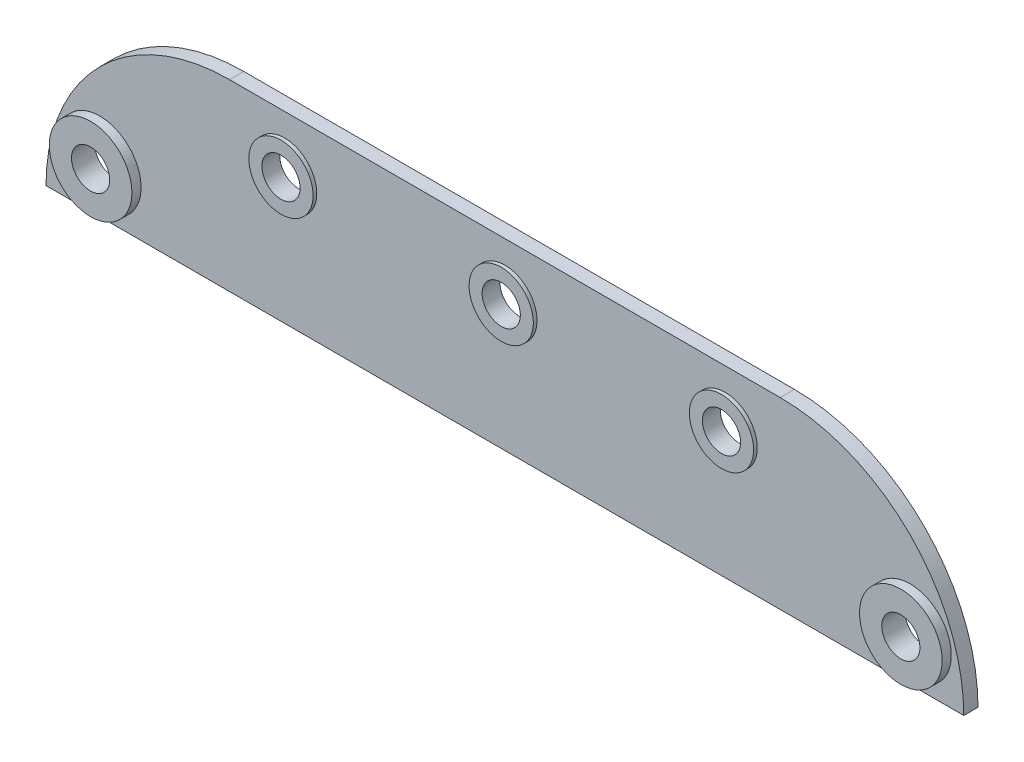
ISO-10303-21;
HEADER;
FILE_DESCRIPTION(('STEP AP214'),'2;1');
FILE_NAME('part.step','',(''),(''),'','','');
FILE_SCHEMA(('AUTOMOTIVE_DESIGN { 1 0 10303 214 1 1 1 1 }'));
ENDSEC;
DATA;
#1=APPLICATION_CONTEXT('core data for automotive mechanical design processes');
#2=APPLICATION_PROTOCOL_DEFINITION('international standard','automotive_design',2000,#1);
#3=PRODUCT_CONTEXT('',#1,'mechanical');
#4=PRODUCT('Part','Part','',(#3));
#5=PRODUCT_RELATED_PRODUCT_CATEGORY('part','',(#4));
#6=PRODUCT_DEFINITION_FORMATION('','',#4);
#7=PRODUCT_DEFINITION_CONTEXT('part definition',#1,'design');
#8=PRODUCT_DEFINITION('design','',#6,#7);
#9=PRODUCT_DEFINITION_SHAPE('','',#8);
#10=(LENGTH_UNIT() NAMED_UNIT(*) SI_UNIT(.MILLI.,.METRE.));
#11=(NAMED_UNIT(*) PLANE_ANGLE_UNIT() SI_UNIT($,.RADIAN.));
#12=(NAMED_UNIT(*) SI_UNIT($,.STERADIAN.) SOLID_ANGLE_UNIT());
#13=UNCERTAINTY_MEASURE_WITH_UNIT(LENGTH_MEASURE(1.E-05),#10,'distance_accuracy_value','');
#14=(GEOMETRIC_REPRESENTATION_CONTEXT(3) GLOBAL_UNCERTAINTY_ASSIGNED_CONTEXT((#13)) GLOBAL_UNIT_ASSIGNED_CONTEXT((#10,
#11,#12)) REPRESENTATION_CONTEXT('',''));
#15=CARTESIAN_POINT('',(0.,0.,0.));
#16=DIRECTION('',(0.,0.,1.));
#17=DIRECTION('',(1.,0.,0.));
#18=AXIS2_PLACEMENT_3D('',#15,#16,#17);
#19=CARTESIAN_POINT('',(60.0000000000001,-20.,3.1));
#20=DIRECTION('',(0.,0.,-1.));
#21=DIRECTION('',(-1.,0.,0.));
#22=AXIS2_PLACEMENT_3D('',#19,#20,#21);
#23=PLANE('',#22);
#24=CARTESIAN_POINT('',(-88.284271247462,-10.,3.1));
#25=DIRECTION('',(0.,0.,-1.));
#26=DIRECTION('',(-1.,0.,0.));
#27=AXIS2_PLACEMENT_3D('',#24,#25,#26);
#28=CIRCLE('',#27,9.);
#29=CARTESIAN_POINT('',(-97.284271247462,-10.,3.1));
#30=VERTEX_POINT('',#29);
#31=EDGE_CURVE('E42',#30,#30,#28,.F.);
#32=ORIENTED_EDGE('',*,*,#31,.F.);
#33=EDGE_LOOP('',(#32));
#34=FACE_BOUND('',#33,.T.);
#35=CARTESIAN_POINT('',(0.,8.,3.1));
#36=DIRECTION('',(0.,0.,-1.));
#37=DIRECTION('',(-1.,0.,0.));
#38=AXIS2_PLACEMENT_3D('',#35,#36,#37);
#39=CIRCLE('',#38,7.);
#40=CARTESIAN_POINT('',(-7.,8.,3.1));
#41=VERTEX_POINT('',#40);
#42=EDGE_CURVE('E114',#41,#41,#39,.F.);
#43=ORIENTED_EDGE('',*,*,#42,.F.);
#44=EDGE_LOOP('',(#43));
#45=FACE_BOUND('',#44,.T.);
#46=CARTESIAN_POINT('',(60.0000000000001,-20.,3.1));
#47=DIRECTION('',(0.,0.,1.));
#48=DIRECTION('',(-1.,0.,0.));
#49=AXIS2_PLACEMENT_3D('',#46,#47,#48);
#50=CIRCLE('',#49,40.);
#51=CARTESIAN_POINT('',(100.,-20.,3.1));
#52=VERTEX_POINT('',#51);
#53=CARTESIAN_POINT('',(60.0000000000001,20.,3.1));
#54=VERTEX_POINT('',#53);
#55=EDGE_CURVE('E86',#52,#54,#50,.T.);
#56=ORIENTED_EDGE('',*,*,#55,.T.);
#57=DIRECTION('',(-1.,0.,0.));
#58=VECTOR('',#57,1.);
#59=CARTESIAN_POINT('',(-60.0000000000001,20.,3.1));
#60=LINE('',#59,#58);
#61=CARTESIAN_POINT('',(-60.0000000000001,20.,3.1));
#62=VERTEX_POINT('',#61);
#63=EDGE_CURVE('E81',#54,#62,#60,.T.);
#64=ORIENTED_EDGE('',*,*,#63,.T.);
#65=CARTESIAN_POINT('',(-60.0000000000001,-20.,3.1));
#66=DIRECTION('',(0.,0.,1.));
#67=DIRECTION('',(1.,0.,0.));
#68=AXIS2_PLACEMENT_3D('',#65,#66,#67);
#69=CIRCLE('',#68,40.);
#70=CARTESIAN_POINT('',(-100.,-20.,3.1));
#71=VERTEX_POINT('',#70);
#72=EDGE_CURVE('E84',#62,#71,#69,.T.);
#73=ORIENTED_EDGE('',*,*,#72,.T.);
#74=DIRECTION('',(1.,0.,0.));
#75=VECTOR('',#74,1.);
#76=CARTESIAN_POINT('',(-100.,-20.,3.1));
#77=LINE('',#76,#75);
#78=EDGE_CURVE('E50',#71,#52,#77,.T.);
#79=ORIENTED_EDGE('',*,*,#78,.T.);
#80=EDGE_LOOP('',(#56,#64,#73,#79));
#81=FACE_BOUND('',#80,.T.);
#82=CARTESIAN_POINT('',(-48.,8.,3.1));
#83=DIRECTION('',(0.,0.,-1.));
#84=DIRECTION('',(-1.,0.,0.));
#85=AXIS2_PLACEMENT_3D('',#82,#83,#84);
#86=CIRCLE('',#85,7.);
#87=CARTESIAN_POINT('',(-55.,8.,3.1));
#88=VERTEX_POINT('',#87);
#89=EDGE_CURVE('E111',#88,#88,#86,.F.);
#90=ORIENTED_EDGE('',*,*,#89,.F.);
#91=EDGE_LOOP('',(#90));
#92=FACE_BOUND('',#91,.T.);
#93=CARTESIAN_POINT('',(48.,8.,3.1));
#94=DIRECTION('',(0.,0.,-1.));
#95=DIRECTION('',(-1.,0.,0.));
#96=AXIS2_PLACEMENT_3D('',#93,#94,#95);
#97=CIRCLE('',#96,7.);
#98=CARTESIAN_POINT('',(41.,8.,3.1));
#99=VERTEX_POINT('',#98);
#100=EDGE_CURVE('E117',#99,#99,#97,.F.);
#101=ORIENTED_EDGE('',*,*,#100,.F.);
#102=EDGE_LOOP('',(#101));
#103=FACE_BOUND('',#102,.T.);
#104=CARTESIAN_POINT('',(88.284271247462,-10.,3.1));
#105=DIRECTION('',(0.,0.,-1.));
#106=DIRECTION('',(-1.,0.,0.));
#107=AXIS2_PLACEMENT_3D('',#104,#105,#106);
#108=CIRCLE('',#107,9.);
#109=CARTESIAN_POINT('',(79.284271247462,-10.,3.1));
#110=VERTEX_POINT('',#109);
#111=EDGE_CURVE('E11',#110,#110,#108,.F.);
#112=ORIENTED_EDGE('',*,*,#111,.F.);
#113=EDGE_LOOP('',(#112));
#114=FACE_BOUND('',#113,.T.);
#115=ADVANCED_FACE('F33',(#34,#45,#81,#92,#103,#114),#23,.F.);
#116=CARTESIAN_POINT('',(60.0000000000001,-20.,0.));
#117=DIRECTION('',(0.,0.,-1.));
#118=DIRECTION('',(-1.,0.,0.));
#119=AXIS2_PLACEMENT_3D('',#116,#117,#118);
#120=PLANE('',#119);
#121=CARTESIAN_POINT('',(-88.284271247462,-10.,0.));
#122=DIRECTION('',(0.,0.,1.));
#123=DIRECTION('',(1.,0.,0.));
#124=AXIS2_PLACEMENT_3D('',#121,#122,#123);
#125=CIRCLE('',#124,4.165);
#126=CARTESIAN_POINT('',(-92.449271247462,-10.,0.));
#127=VERTEX_POINT('',#126);
#128=EDGE_CURVE('E203',#127,#127,#125,.T.);
#129=ORIENTED_EDGE('',*,*,#128,.T.);
#130=EDGE_LOOP('',(#129));
#131=FACE_BOUND('',#130,.T.);
#132=CARTESIAN_POINT('',(48.,8.,0.));
#133=DIRECTION('',(0.,0.,1.));
#134=DIRECTION('',(1.,0.,0.));
#135=AXIS2_PLACEMENT_3D('',#132,#133,#134);
#136=CIRCLE('',#135,4.165);
#137=CARTESIAN_POINT('',(43.835,8.,0.));
#138=VERTEX_POINT('',#137);
#139=EDGE_CURVE('E214',#138,#138,#136,.T.);
#140=ORIENTED_EDGE('',*,*,#139,.T.);
#141=EDGE_LOOP('',(#140));
#142=FACE_BOUND('',#141,.T.);
#143=CARTESIAN_POINT('',(60.0000000000001,-20.,0.));
#144=DIRECTION('',(0.,0.,1.));
#145=DIRECTION('',(-1.,0.,0.));
#146=AXIS2_PLACEMENT_3D('',#143,#144,#145);
#147=CIRCLE('',#146,40.);
#148=CARTESIAN_POINT('',(100.,-20.,0.));
#149=VERTEX_POINT('',#148);
#150=CARTESIAN_POINT('',(60.0000000000001,20.,0.));
#151=VERTEX_POINT('',#150);
#152=EDGE_CURVE('E101',#149,#151,#147,.T.);
#153=ORIENTED_EDGE('',*,*,#152,.F.);
#154=DIRECTION('',(1.,0.,0.));
#155=VECTOR('',#154,1.);
#156=CARTESIAN_POINT('',(-100.,-20.,0.));
#157=LINE('',#156,#155);
#158=CARTESIAN_POINT('',(-100.,-20.,0.));
#159=VERTEX_POINT('',#158);
#160=EDGE_CURVE('E73',#159,#149,#157,.T.);
#161=ORIENTED_EDGE('',*,*,#160,.F.);
#162=CARTESIAN_POINT('',(-60.0000000000001,-20.,0.));
#163=DIRECTION('',(0.,0.,1.));
#164=DIRECTION('',(1.,0.,0.));
#165=AXIS2_PLACEMENT_3D('',#162,#163,#164);
#166=CIRCLE('',#165,40.);
#167=CARTESIAN_POINT('',(-60.0000000000001,20.,0.));
#168=VERTEX_POINT('',#167);
#169=EDGE_CURVE('E67',#168,#159,#166,.T.);
#170=ORIENTED_EDGE('',*,*,#169,.F.);
#171=DIRECTION('',(-1.,0.,0.));
#172=VECTOR('',#171,1.);
#173=CARTESIAN_POINT('',(-60.0000000000001,20.,0.));
#174=LINE('',#173,#172);
#175=EDGE_CURVE('E91',#151,#168,#174,.T.);
#176=ORIENTED_EDGE('',*,*,#175,.F.);
#177=EDGE_LOOP('',(#153,#161,#170,#176));
#178=FACE_BOUND('',#177,.T.);
#179=CARTESIAN_POINT('',(0.,8.,0.));
#180=DIRECTION('',(0.,0.,1.));
#181=DIRECTION('',(1.,0.,0.));
#182=AXIS2_PLACEMENT_3D('',#179,#180,#181);
#183=CIRCLE('',#182,4.165);
#184=CARTESIAN_POINT('',(-4.165,8.,0.));
#185=VERTEX_POINT('',#184);
#186=EDGE_CURVE('E104',#185,#185,#183,.T.);
#187=ORIENTED_EDGE('',*,*,#186,.T.);
#188=EDGE_LOOP('',(#187));
#189=FACE_BOUND('',#188,.T.);
#190=CARTESIAN_POINT('',(-48.,8.,0.));
#191=DIRECTION('',(0.,0.,1.));
#192=DIRECTION('',(1.,0.,0.));
#193=AXIS2_PLACEMENT_3D('',#190,#191,#192);
#194=CIRCLE('',#193,4.165);
#195=CARTESIAN_POINT('',(-52.165,8.,0.));
#196=VERTEX_POINT('',#195);
#197=EDGE_CURVE('E199',#196,#196,#194,.T.);
#198=ORIENTED_EDGE('',*,*,#197,.T.);
#199=EDGE_LOOP('',(#198));
#200=FACE_BOUND('',#199,.T.);
#201=CARTESIAN_POINT('',(88.284271247462,-10.,0.));
#202=DIRECTION('',(0.,0.,1.));
#203=DIRECTION('',(1.,0.,0.));
#204=AXIS2_PLACEMENT_3D('',#201,#202,#203);
#205=CIRCLE('',#204,4.165);
#206=CARTESIAN_POINT('',(84.119271247462,-10.,0.));
#207=VERTEX_POINT('',#206);
#208=EDGE_CURVE('E202',#207,#207,#205,.T.);
#209=ORIENTED_EDGE('',*,*,#208,.T.);
#210=EDGE_LOOP('',(#209));
#211=FACE_BOUND('',#210,.T.);
#212=ADVANCED_FACE('F126',(#131,#142,#178,#189,#200,#211),#120,.T.);
#213=CARTESIAN_POINT('',(60.0000000000001,-20.,3.1));
#214=DIRECTION('',(0.,0.,-1.));
#215=DIRECTION('',(-1.,0.,0.));
#216=AXIS2_PLACEMENT_3D('',#213,#214,#215);
#217=CYLINDRICAL_SURFACE('',#216,40.);
#218=ORIENTED_EDGE('',*,*,#152,.T.);
#219=DIRECTION('',(0.,0.,-1.));
#220=VECTOR('',#219,1.);
#221=CARTESIAN_POINT('',(60.0000000000001,20.,3.1));
#222=LINE('',#221,#220);
#223=EDGE_CURVE('E92',#54,#151,#222,.T.);
#224=ORIENTED_EDGE('',*,*,#223,.F.);
#225=ORIENTED_EDGE('',*,*,#55,.F.);
#226=DIRECTION('',(0.,0.,-1.));
#227=VECTOR('',#226,1.);
#228=CARTESIAN_POINT('',(100.,-20.,3.1));
#229=LINE('',#228,#227);
#230=EDGE_CURVE('E97',#52,#149,#229,.T.);
#231=ORIENTED_EDGE('',*,*,#230,.T.);
#232=EDGE_LOOP('',(#218,#224,#225,#231));
#233=FACE_BOUND('',#232,.T.);
#234=ADVANCED_FACE('F35',(#233),#217,.T.);
#235=CARTESIAN_POINT('',(-60.0000000000001,20.,3.1));
#236=DIRECTION('',(0.,-1.,0.));
#237=DIRECTION('',(0.,0.,-1.));
#238=AXIS2_PLACEMENT_3D('',#235,#236,#237);
#239=PLANE('',#238);
#240=ORIENTED_EDGE('',*,*,#175,.T.);
#241=DIRECTION('',(0.,0.,-1.));
#242=VECTOR('',#241,1.);
#243=CARTESIAN_POINT('',(-60.0000000000001,20.,3.1));
#244=LINE('',#243,#242);
#245=EDGE_CURVE('E89',#62,#168,#244,.T.);
#246=ORIENTED_EDGE('',*,*,#245,.F.);
#247=ORIENTED_EDGE('',*,*,#63,.F.);
#248=ORIENTED_EDGE('',*,*,#223,.T.);
#249=EDGE_LOOP('',(#240,#246,#247,#248));
#250=FACE_BOUND('',#249,.T.);
#251=ADVANCED_FACE('F90',(#250),#239,.F.);
#252=CARTESIAN_POINT('',(-60.0000000000001,-20.,3.1));
#253=DIRECTION('',(0.,0.,-1.));
#254=DIRECTION('',(-1.,0.,0.));
#255=AXIS2_PLACEMENT_3D('',#252,#253,#254);
#256=CYLINDRICAL_SURFACE('',#255,40.);
#257=ORIENTED_EDGE('',*,*,#169,.T.);
#258=DIRECTION('',(0.,0.,-1.));
#259=VECTOR('',#258,1.);
#260=CARTESIAN_POINT('',(-100.,-20.,3.1));
#261=LINE('',#260,#259);
#262=EDGE_CURVE('E93',#71,#159,#261,.T.);
#263=ORIENTED_EDGE('',*,*,#262,.F.);
#264=ORIENTED_EDGE('',*,*,#72,.F.);
#265=ORIENTED_EDGE('',*,*,#245,.T.);
#266=EDGE_LOOP('',(#257,#263,#264,#265));
#267=FACE_BOUND('',#266,.T.);
#268=ADVANCED_FACE('F95',(#267),#256,.T.);
#269=CARTESIAN_POINT('',(-100.,-20.,3.1));
#270=DIRECTION('',(0.,1.,0.));
#271=DIRECTION('',(0.,0.,1.));
#272=AXIS2_PLACEMENT_3D('',#269,#270,#271);
#273=PLANE('',#272);
#274=ORIENTED_EDGE('',*,*,#160,.T.);
#275=ORIENTED_EDGE('',*,*,#230,.F.);
#276=ORIENTED_EDGE('',*,*,#78,.F.);
#277=ORIENTED_EDGE('',*,*,#262,.T.);
#278=EDGE_LOOP('',(#274,#275,#276,#277));
#279=FACE_BOUND('',#278,.T.);
#280=ADVANCED_FACE('F174',(#279),#273,.F.);
#281=CARTESIAN_POINT('',(0.,8.,3.1));
#282=DIRECTION('',(0.,0.,-1.));
#283=DIRECTION('',(-1.,0.,0.));
#284=AXIS2_PLACEMENT_3D('',#281,#282,#283);
#285=CYLINDRICAL_SURFACE('',#284,4.165);
#286=CARTESIAN_POINT('',(0.,8.,3.9));
#287=DIRECTION('',(0.,0.,1.));
#288=DIRECTION('',(1.,0.,0.));
#289=AXIS2_PLACEMENT_3D('',#286,#287,#288);
#290=CIRCLE('',#289,4.165);
#291=CARTESIAN_POINT('',(-4.165,8.,3.9));
#292=VERTEX_POINT('',#291);
#293=EDGE_CURVE('E228',#292,#292,#290,.T.);
#294=CARTESIAN_POINT('',(-4.165,8.,0.));
#295=CARTESIAN_POINT('',(-4.165,8.,0.040625));
#296=CARTESIAN_POINT('',(-4.165,8.,0.08125));
#297=CARTESIAN_POINT('',(-4.165,8.,0.1625));
#298=CARTESIAN_POINT('',(-4.165,8.,0.203125));
#299=CARTESIAN_POINT('',(-4.165,8.,0.284375));
#300=CARTESIAN_POINT('',(-4.165,8.,0.325));
#301=CARTESIAN_POINT('',(-4.165,8.,0.40625));
#302=CARTESIAN_POINT('',(-4.165,8.,0.446875));
#303=CARTESIAN_POINT('',(-4.165,8.,0.528125));
#304=CARTESIAN_POINT('',(-4.165,8.,0.56875));
#305=CARTESIAN_POINT('',(-4.165,8.,0.65));
#306=CARTESIAN_POINT('',(-4.165,8.,0.690625));
#307=CARTESIAN_POINT('',(-4.165,8.,0.771875));
#308=CARTESIAN_POINT('',(-4.165,8.,0.8125));
#309=CARTESIAN_POINT('',(-4.165,8.,0.89375));
#310=CARTESIAN_POINT('',(-4.165,8.,0.934375));
#311=CARTESIAN_POINT('',(-4.165,8.,1.015625));
#312=CARTESIAN_POINT('',(-4.165,8.,1.05625));
#313=CARTESIAN_POINT('',(-4.165,8.,1.1375));
#314=CARTESIAN_POINT('',(-4.165,8.,1.178125));
#315=CARTESIAN_POINT('',(-4.165,8.,1.259375));
#316=CARTESIAN_POINT('',(-4.165,8.,1.3));
#317=CARTESIAN_POINT('',(-4.165,8.,1.38125));
#318=CARTESIAN_POINT('',(-4.165,8.,1.421875));
#319=CARTESIAN_POINT('',(-4.165,8.,1.503125));
#320=CARTESIAN_POINT('',(-4.165,8.,1.54375));
#321=CARTESIAN_POINT('',(-4.165,8.,1.625));
#322=CARTESIAN_POINT('',(-4.165,8.,1.665625));
#323=CARTESIAN_POINT('',(-4.165,8.,1.746875));
#324=CARTESIAN_POINT('',(-4.165,8.,1.7875));
#325=CARTESIAN_POINT('',(-4.165,8.,1.86875));
#326=CARTESIAN_POINT('',(-4.165,8.,1.909375));
#327=CARTESIAN_POINT('',(-4.165,8.,1.990625));
#328=CARTESIAN_POINT('',(-4.165,8.,2.03125));
#329=CARTESIAN_POINT('',(-4.165,8.,2.1125));
#330=CARTESIAN_POINT('',(-4.165,8.,2.153125));
#331=CARTESIAN_POINT('',(-4.165,8.,2.234375));
#332=CARTESIAN_POINT('',(-4.165,8.,2.275));
#333=CARTESIAN_POINT('',(-4.165,8.,2.35625));
#334=CARTESIAN_POINT('',(-4.165,8.,2.396875));
#335=CARTESIAN_POINT('',(-4.165,8.,2.478125));
#336=CARTESIAN_POINT('',(-4.165,8.,2.51875));
#337=CARTESIAN_POINT('',(-4.165,8.,2.6));
#338=CARTESIAN_POINT('',(-4.165,8.,2.640625));
#339=CARTESIAN_POINT('',(-4.165,8.,2.721875));
#340=CARTESIAN_POINT('',(-4.165,8.,2.7625));
#341=CARTESIAN_POINT('',(-4.165,8.,2.84375));
#342=CARTESIAN_POINT('',(-4.165,8.,2.884375));
#343=CARTESIAN_POINT('',(-4.165,8.,2.965625));
#344=CARTESIAN_POINT('',(-4.165,8.,3.00625));
#345=CARTESIAN_POINT('',(-4.165,8.,3.0875));
#346=CARTESIAN_POINT('',(-4.165,8.,3.128125));
#347=CARTESIAN_POINT('',(-4.165,8.,3.209375));
#348=CARTESIAN_POINT('',(-4.165,8.,3.25));
#349=CARTESIAN_POINT('',(-4.165,8.,3.33125));
#350=CARTESIAN_POINT('',(-4.165,8.,3.371875));
#351=CARTESIAN_POINT('',(-4.165,8.,3.453125));
#352=CARTESIAN_POINT('',(-4.165,8.,3.49375));
#353=CARTESIAN_POINT('',(-4.165,8.,3.575));
#354=CARTESIAN_POINT('',(-4.165,8.,3.615625));
#355=CARTESIAN_POINT('',(-4.165,8.,3.696875));
#356=CARTESIAN_POINT('',(-4.165,8.,3.7375));
#357=CARTESIAN_POINT('',(-4.165,8.,3.81875));
#358=CARTESIAN_POINT('',(-4.165,8.,3.859375));
#359=CARTESIAN_POINT('',(-4.165,8.,3.9));
#360=B_SPLINE_CURVE_WITH_KNOTS('',3,(#294,#295,#296,#297,#298,#299,#300,#301,#302,#303,#304,
#305,#306,#307,#308,#309,#310,#311,#312,#313,#314,#315,#316,#317,#318,#319,#320,#321,#322,#323,
#324,#325,#326,#327,#328,#329,#330,#331,#332,#333,#334,#335,#336,#337,#338,#339,#340,#341,#342,
#343,#344,#345,#346,#347,#348,#349,#350,#351,#352,#353,#354,#355,#356,#357,#358,#359),
.UNSPECIFIED.,.F.,.F.,(4,2,2,2,2,2,2,2,2,2,2,2,2,2,2,2,2,2,2,2,2,2,2,2,2,2,2,2,2,2,2,2,4),(0.,
0.121875,0.24375,0.365625,0.4875,0.609375,0.73125,0.853125,0.975,1.096875,1.21875,1.340625,
1.4625,1.584375,1.70625,1.828125,1.95,2.071875,2.19375,2.315625,2.4375,2.559375,2.68125,
2.803125,2.925,3.046875,3.16875,3.290625,3.4125,3.534375,3.65625,3.778125,3.9),.UNSPECIFIED.);
#361=EDGE_CURVE('BSEAM171',#185,#292,#360,.T.);
#362=ORIENTED_EDGE('',*,*,#186,.F.);
#363=ORIENTED_EDGE('',*,*,#293,.T.);
#364=ORIENTED_EDGE('',*,*,#361,.T.);
#365=ORIENTED_EDGE('',*,*,#361,.F.);
#366=EDGE_LOOP('',(#362,#364,#363,#365));
#367=FACE_BOUND('',#366,.T.);
#368=ADVANCED_FACE('F171',(#367),#285,.F.);
#369=CARTESIAN_POINT('',(48.,8.,3.1));
#370=DIRECTION('',(0.,0.,-1.));
#371=DIRECTION('',(-1.,0.,0.));
#372=AXIS2_PLACEMENT_3D('',#369,#370,#371);
#373=CYLINDRICAL_SURFACE('',#372,4.165);
#374=CARTESIAN_POINT('',(48.,8.,3.9));
#375=DIRECTION('',(0.,0.,1.));
#376=DIRECTION('',(1.,0.,0.));
#377=AXIS2_PLACEMENT_3D('',#374,#375,#376);
#378=CIRCLE('',#377,4.165);
#379=CARTESIAN_POINT('',(43.835,8.,3.9));
#380=VERTEX_POINT('',#379);
#381=EDGE_CURVE('E222',#380,#380,#378,.T.);
#382=CARTESIAN_POINT('',(43.835,8.,0.));
#383=CARTESIAN_POINT('',(43.835,8.,0.040625));
#384=CARTESIAN_POINT('',(43.835,8.,0.08125));
#385=CARTESIAN_POINT('',(43.835,8.,0.1625));
#386=CARTESIAN_POINT('',(43.835,8.,0.203125));
#387=CARTESIAN_POINT('',(43.835,8.,0.284375));
#388=CARTESIAN_POINT('',(43.835,8.,0.325));
#389=CARTESIAN_POINT('',(43.835,8.,0.40625));
#390=CARTESIAN_POINT('',(43.835,8.,0.446875));
#391=CARTESIAN_POINT('',(43.835,8.,0.528125));
#392=CARTESIAN_POINT('',(43.835,8.,0.56875));
#393=CARTESIAN_POINT('',(43.835,8.,0.65));
#394=CARTESIAN_POINT('',(43.835,8.,0.690625));
#395=CARTESIAN_POINT('',(43.835,8.,0.771875));
#396=CARTESIAN_POINT('',(43.835,8.,0.8125));
#397=CARTESIAN_POINT('',(43.835,8.,0.89375));
#398=CARTESIAN_POINT('',(43.835,8.,0.934375));
#399=CARTESIAN_POINT('',(43.835,8.,1.015625));
#400=CARTESIAN_POINT('',(43.835,8.,1.05625));
#401=CARTESIAN_POINT('',(43.835,8.,1.1375));
#402=CARTESIAN_POINT('',(43.835,8.,1.178125));
#403=CARTESIAN_POINT('',(43.835,8.,1.259375));
#404=CARTESIAN_POINT('',(43.835,8.,1.3));
#405=CARTESIAN_POINT('',(43.835,8.,1.38125));
#406=CARTESIAN_POINT('',(43.835,8.,1.421875));
#407=CARTESIAN_POINT('',(43.835,8.,1.503125));
#408=CARTESIAN_POINT('',(43.835,8.,1.54375));
#409=CARTESIAN_POINT('',(43.835,8.,1.625));
#410=CARTESIAN_POINT('',(43.835,8.,1.665625));
#411=CARTESIAN_POINT('',(43.835,8.,1.746875));
#412=CARTESIAN_POINT('',(43.835,8.,1.7875));
#413=CARTESIAN_POINT('',(43.835,8.,1.86875));
#414=CARTESIAN_POINT('',(43.835,8.,1.909375));
#415=CARTESIAN_POINT('',(43.835,8.,1.990625));
#416=CARTESIAN_POINT('',(43.835,8.,2.03125));
#417=CARTESIAN_POINT('',(43.835,8.,2.1125));
#418=CARTESIAN_POINT('',(43.835,8.,2.153125));
#419=CARTESIAN_POINT('',(43.835,8.,2.234375));
#420=CARTESIAN_POINT('',(43.835,8.,2.275));
#421=CARTESIAN_POINT('',(43.835,8.,2.35625));
#422=CARTESIAN_POINT('',(43.835,8.,2.396875));
#423=CARTESIAN_POINT('',(43.835,8.,2.478125));
#424=CARTESIAN_POINT('',(43.835,8.,2.51875));
#425=CARTESIAN_POINT('',(43.835,8.,2.6));
#426=CARTESIAN_POINT('',(43.835,8.,2.640625));
#427=CARTESIAN_POINT('',(43.835,8.,2.721875));
#428=CARTESIAN_POINT('',(43.835,8.,2.7625));
#429=CARTESIAN_POINT('',(43.835,8.,2.84375));
#430=CARTESIAN_POINT('',(43.835,8.,2.884375));
#431=CARTESIAN_POINT('',(43.835,8.,2.965625));
#432=CARTESIAN_POINT('',(43.835,8.,3.00625));
#433=CARTESIAN_POINT('',(43.835,8.,3.0875));
#434=CARTESIAN_POINT('',(43.835,8.,3.128125));
#435=CARTESIAN_POINT('',(43.835,8.,3.209375));
#436=CARTESIAN_POINT('',(43.835,8.,3.25));
#437=CARTESIAN_POINT('',(43.835,8.,3.33125));
#438=CARTESIAN_POINT('',(43.835,8.,3.371875));
#439=CARTESIAN_POINT('',(43.835,8.,3.453125));
#440=CARTESIAN_POINT('',(43.835,8.,3.49375));
#441=CARTESIAN_POINT('',(43.835,8.,3.575));
#442=CARTESIAN_POINT('',(43.835,8.,3.615625));
#443=CARTESIAN_POINT('',(43.835,8.,3.696875));
#444=CARTESIAN_POINT('',(43.835,8.,3.7375));
#445=CARTESIAN_POINT('',(43.835,8.,3.81875));
#446=CARTESIAN_POINT('',(43.835,8.,3.859375));
#447=CARTESIAN_POINT('',(43.835,8.,3.9));
#448=B_SPLINE_CURVE_WITH_KNOTS('',3,(#382,#383,#384,#385,#386,#387,#388,#389,#390,#391,#392,
#393,#394,#395,#396,#397,#398,#399,#400,#401,#402,#403,#404,#405,#406,#407,#408,#409,#410,#411,
#412,#413,#414,#415,#416,#417,#418,#419,#420,#421,#422,#423,#424,#425,#426,#427,#428,#429,#430,
#431,#432,#433,#434,#435,#436,#437,#438,#439,#440,#441,#442,#443,#444,#445,#446,#447),
.UNSPECIFIED.,.F.,.F.,(4,2,2,2,2,2,2,2,2,2,2,2,2,2,2,2,2,2,2,2,2,2,2,2,2,2,2,2,2,2,2,2,4),(0.,
0.121875,0.24375,0.365625,0.4875,0.609375,0.73125,0.853125,0.975,1.096875,1.21875,1.340625,
1.4625,1.584375,1.70625,1.828125,1.95,2.071875,2.19375,2.315625,2.4375,2.559375,2.68125,
2.803125,2.925,3.046875,3.16875,3.290625,3.4125,3.534375,3.65625,3.778125,3.9),.UNSPECIFIED.);
#449=EDGE_CURVE('BSEAM167',#138,#380,#448,.T.);
#450=ORIENTED_EDGE('',*,*,#139,.F.);
#451=ORIENTED_EDGE('',*,*,#381,.T.);
#452=ORIENTED_EDGE('',*,*,#449,.T.);
#453=ORIENTED_EDGE('',*,*,#449,.F.);
#454=EDGE_LOOP('',(#450,#452,#451,#453));
#455=FACE_BOUND('',#454,.T.);
#456=ADVANCED_FACE('F167',(#455),#373,.F.);
#457=CARTESIAN_POINT('',(-48.,8.,3.1));
#458=DIRECTION('',(0.,0.,-1.));
#459=DIRECTION('',(-1.,0.,0.));
#460=AXIS2_PLACEMENT_3D('',#457,#458,#459);
#461=CYLINDRICAL_SURFACE('',#460,4.165);
#462=CARTESIAN_POINT('',(-48.,8.,3.9));
#463=DIRECTION('',(0.,0.,1.));
#464=DIRECTION('',(1.,0.,0.));
#465=AXIS2_PLACEMENT_3D('',#462,#463,#464);
#466=CIRCLE('',#465,4.165);
#467=CARTESIAN_POINT('',(-52.165,8.,3.9));
#468=VERTEX_POINT('',#467);
#469=EDGE_CURVE('E209',#468,#468,#466,.T.);
#470=CARTESIAN_POINT('',(-52.165,8.,0.));
#471=CARTESIAN_POINT('',(-52.165,8.,0.040625));
#472=CARTESIAN_POINT('',(-52.165,8.,0.08125));
#473=CARTESIAN_POINT('',(-52.165,8.,0.1625));
#474=CARTESIAN_POINT('',(-52.165,8.,0.203125));
#475=CARTESIAN_POINT('',(-52.165,8.,0.284375));
#476=CARTESIAN_POINT('',(-52.165,8.,0.325));
#477=CARTESIAN_POINT('',(-52.165,8.,0.40625));
#478=CARTESIAN_POINT('',(-52.165,8.,0.446875));
#479=CARTESIAN_POINT('',(-52.165,8.,0.528125));
#480=CARTESIAN_POINT('',(-52.165,8.,0.56875));
#481=CARTESIAN_POINT('',(-52.165,8.,0.65));
#482=CARTESIAN_POINT('',(-52.165,8.,0.690625));
#483=CARTESIAN_POINT('',(-52.165,8.,0.771875));
#484=CARTESIAN_POINT('',(-52.165,8.,0.8125));
#485=CARTESIAN_POINT('',(-52.165,8.,0.89375));
#486=CARTESIAN_POINT('',(-52.165,8.,0.934375));
#487=CARTESIAN_POINT('',(-52.165,8.,1.015625));
#488=CARTESIAN_POINT('',(-52.165,8.,1.05625));
#489=CARTESIAN_POINT('',(-52.165,8.,1.1375));
#490=CARTESIAN_POINT('',(-52.165,8.,1.178125));
#491=CARTESIAN_POINT('',(-52.165,8.,1.259375));
#492=CARTESIAN_POINT('',(-52.165,8.,1.3));
#493=CARTESIAN_POINT('',(-52.165,8.,1.38125));
#494=CARTESIAN_POINT('',(-52.165,8.,1.421875));
#495=CARTESIAN_POINT('',(-52.165,8.,1.503125));
#496=CARTESIAN_POINT('',(-52.165,8.,1.54375));
#497=CARTESIAN_POINT('',(-52.165,8.,1.625));
#498=CARTESIAN_POINT('',(-52.165,8.,1.665625));
#499=CARTESIAN_POINT('',(-52.165,8.,1.746875));
#500=CARTESIAN_POINT('',(-52.165,8.,1.7875));
#501=CARTESIAN_POINT('',(-52.165,8.,1.86875));
#502=CARTESIAN_POINT('',(-52.165,8.,1.909375));
#503=CARTESIAN_POINT('',(-52.165,8.,1.990625));
#504=CARTESIAN_POINT('',(-52.165,8.,2.03125));
#505=CARTESIAN_POINT('',(-52.165,8.,2.1125));
#506=CARTESIAN_POINT('',(-52.165,8.,2.153125));
#507=CARTESIAN_POINT('',(-52.165,8.,2.234375));
#508=CARTESIAN_POINT('',(-52.165,8.,2.275));
#509=CARTESIAN_POINT('',(-52.165,8.,2.35625));
#510=CARTESIAN_POINT('',(-52.165,8.,2.396875));
#511=CARTESIAN_POINT('',(-52.165,8.,2.478125));
#512=CARTESIAN_POINT('',(-52.165,8.,2.51875));
#513=CARTESIAN_POINT('',(-52.165,8.,2.6));
#514=CARTESIAN_POINT('',(-52.165,8.,2.640625));
#515=CARTESIAN_POINT('',(-52.165,8.,2.721875));
#516=CARTESIAN_POINT('',(-52.165,8.,2.7625));
#517=CARTESIAN_POINT('',(-52.165,8.,2.84375));
#518=CARTESIAN_POINT('',(-52.165,8.,2.884375));
#519=CARTESIAN_POINT('',(-52.165,8.,2.965625));
#520=CARTESIAN_POINT('',(-52.165,8.,3.00625));
#521=CARTESIAN_POINT('',(-52.165,8.,3.0875));
#522=CARTESIAN_POINT('',(-52.165,8.,3.128125));
#523=CARTESIAN_POINT('',(-52.165,8.,3.209375));
#524=CARTESIAN_POINT('',(-52.165,8.,3.25));
#525=CARTESIAN_POINT('',(-52.165,8.,3.33125));
#526=CARTESIAN_POINT('',(-52.165,8.,3.371875));
#527=CARTESIAN_POINT('',(-52.165,8.,3.453125));
#528=CARTESIAN_POINT('',(-52.165,8.,3.49375));
#529=CARTESIAN_POINT('',(-52.165,8.,3.575));
#530=CARTESIAN_POINT('',(-52.165,8.,3.615625));
#531=CARTESIAN_POINT('',(-52.165,8.,3.696875));
#532=CARTESIAN_POINT('',(-52.165,8.,3.7375));
#533=CARTESIAN_POINT('',(-52.165,8.,3.81875));
#534=CARTESIAN_POINT('',(-52.165,8.,3.859375));
#535=CARTESIAN_POINT('',(-52.165,8.,3.9));
#536=B_SPLINE_CURVE_WITH_KNOTS('',3,(#470,#471,#472,#473,#474,#475,#476,#477,#478,#479,#480,
#481,#482,#483,#484,#485,#486,#487,#488,#489,#490,#491,#492,#493,#494,#495,#496,#497,#498,#499,
#500,#501,#502,#503,#504,#505,#506,#507,#508,#509,#510,#511,#512,#513,#514,#515,#516,#517,#518,
#519,#520,#521,#522,#523,#524,#525,#526,#527,#528,#529,#530,#531,#532,#533,#534,#535),
.UNSPECIFIED.,.F.,.F.,(4,2,2,2,2,2,2,2,2,2,2,2,2,2,2,2,2,2,2,2,2,2,2,2,2,2,2,2,2,2,2,2,4),(0.,
0.121875,0.24375,0.365625,0.4875,0.609375,0.73125,0.853125,0.975,1.096875,1.21875,1.340625,
1.4625,1.584375,1.70625,1.828125,1.95,2.071875,2.19375,2.315625,2.4375,2.559375,2.68125,
2.803125,2.925,3.046875,3.16875,3.290625,3.4125,3.534375,3.65625,3.778125,3.9),.UNSPECIFIED.);
#537=EDGE_CURVE('BSEAM163',#196,#468,#536,.T.);
#538=ORIENTED_EDGE('',*,*,#197,.F.);
#539=ORIENTED_EDGE('',*,*,#469,.T.);
#540=ORIENTED_EDGE('',*,*,#537,.T.);
#541=ORIENTED_EDGE('',*,*,#537,.F.);
#542=EDGE_LOOP('',(#538,#540,#539,#541));
#543=FACE_BOUND('',#542,.T.);
#544=ADVANCED_FACE('F163',(#543),#461,.F.);
#545=CARTESIAN_POINT('',(-88.284271247462,-10.,3.1));
#546=DIRECTION('',(0.,0.,-1.));
#547=DIRECTION('',(-1.,0.,0.));
#548=AXIS2_PLACEMENT_3D('',#545,#546,#547);
#549=CYLINDRICAL_SURFACE('',#548,4.165);
#550=CARTESIAN_POINT('',(-88.284271247462,-10.,5.1));
#551=DIRECTION('',(0.,0.,1.));
#552=DIRECTION('',(1.,0.,0.));
#553=AXIS2_PLACEMENT_3D('',#550,#551,#552);
#554=CIRCLE('',#553,4.165);
#555=CARTESIAN_POINT('',(-92.449271247462,-10.,5.1));
#556=VERTEX_POINT('',#555);
#557=EDGE_CURVE('E231',#556,#556,#554,.T.);
#558=CARTESIAN_POINT('',(-92.449271247462,-10.,0.));
#559=CARTESIAN_POINT('',(-92.449271247462,-10.,0.0531249999999999));
#560=CARTESIAN_POINT('',(-92.449271247462,-10.,0.10625));
#561=CARTESIAN_POINT('',(-92.449271247462,-10.,0.2125));
#562=CARTESIAN_POINT('',(-92.449271247462,-10.,0.265625));
#563=CARTESIAN_POINT('',(-92.449271247462,-10.,0.371875));
#564=CARTESIAN_POINT('',(-92.449271247462,-10.,0.425));
#565=CARTESIAN_POINT('',(-92.449271247462,-10.,0.53125));
#566=CARTESIAN_POINT('',(-92.449271247462,-10.,0.584375));
#567=CARTESIAN_POINT('',(-92.449271247462,-10.,0.690625));
#568=CARTESIAN_POINT('',(-92.449271247462,-10.,0.74375));
#569=CARTESIAN_POINT('',(-92.449271247462,-10.,0.85));
#570=CARTESIAN_POINT('',(-92.449271247462,-10.,0.903125));
#571=CARTESIAN_POINT('',(-92.449271247462,-10.,1.009375));
#572=CARTESIAN_POINT('',(-92.449271247462,-10.,1.0625));
#573=CARTESIAN_POINT('',(-92.449271247462,-10.,1.16875));
#574=CARTESIAN_POINT('',(-92.449271247462,-10.,1.221875));
#575=CARTESIAN_POINT('',(-92.449271247462,-10.,1.328125));
#576=CARTESIAN_POINT('',(-92.449271247462,-10.,1.38125));
#577=CARTESIAN_POINT('',(-92.449271247462,-10.,1.4875));
#578=CARTESIAN_POINT('',(-92.449271247462,-10.,1.540625));
#579=CARTESIAN_POINT('',(-92.449271247462,-10.,1.646875));
#580=CARTESIAN_POINT('',(-92.449271247462,-10.,1.7));
#581=CARTESIAN_POINT('',(-92.449271247462,-10.,1.80625));
#582=CARTESIAN_POINT('',(-92.449271247462,-10.,1.859375));
#583=CARTESIAN_POINT('',(-92.449271247462,-10.,1.965625));
#584=CARTESIAN_POINT('',(-92.449271247462,-10.,2.01875));
#585=CARTESIAN_POINT('',(-92.449271247462,-10.,2.125));
#586=CARTESIAN_POINT('',(-92.449271247462,-10.,2.178125));
#587=CARTESIAN_POINT('',(-92.449271247462,-10.,2.284375));
#588=CARTESIAN_POINT('',(-92.449271247462,-10.,2.3375));
#589=CARTESIAN_POINT('',(-92.449271247462,-10.,2.44375));
#590=CARTESIAN_POINT('',(-92.449271247462,-10.,2.496875));
#591=CARTESIAN_POINT('',(-92.449271247462,-10.,2.603125));
#592=CARTESIAN_POINT('',(-92.449271247462,-10.,2.65625));
#593=CARTESIAN_POINT('',(-92.449271247462,-10.,2.7625));
#594=CARTESIAN_POINT('',(-92.449271247462,-10.,2.815625));
#595=CARTESIAN_POINT('',(-92.449271247462,-10.,2.921875));
#596=CARTESIAN_POINT('',(-92.449271247462,-10.,2.975));
#597=CARTESIAN_POINT('',(-92.449271247462,-10.,3.08125));
#598=CARTESIAN_POINT('',(-92.449271247462,-10.,3.134375));
#599=CARTESIAN_POINT('',(-92.449271247462,-10.,3.240625));
#600=CARTESIAN_POINT('',(-92.449271247462,-10.,3.29375));
#601=CARTESIAN_POINT('',(-92.449271247462,-10.,3.4));
#602=CARTESIAN_POINT('',(-92.449271247462,-10.,3.453125));
#603=CARTESIAN_POINT('',(-92.449271247462,-10.,3.559375));
#604=CARTESIAN_POINT('',(-92.449271247462,-10.,3.6125));
#605=CARTESIAN_POINT('',(-92.449271247462,-10.,3.71875));
#606=CARTESIAN_POINT('',(-92.449271247462,-10.,3.771875));
#607=CARTESIAN_POINT('',(-92.449271247462,-10.,3.878125));
#608=CARTESIAN_POINT('',(-92.449271247462,-10.,3.93125));
#609=CARTESIAN_POINT('',(-92.449271247462,-10.,4.0375));
#610=CARTESIAN_POINT('',(-92.449271247462,-10.,4.090625));
#611=CARTESIAN_POINT('',(-92.449271247462,-10.,4.196875));
#612=CARTESIAN_POINT('',(-92.449271247462,-10.,4.25));
#613=CARTESIAN_POINT('',(-92.449271247462,-10.,4.35625));
#614=CARTESIAN_POINT('',(-92.449271247462,-10.,4.409375));
#615=CARTESIAN_POINT('',(-92.449271247462,-10.,4.515625));
#616=CARTESIAN_POINT('',(-92.449271247462,-10.,4.56875));
#617=CARTESIAN_POINT('',(-92.449271247462,-10.,4.675));
#618=CARTESIAN_POINT('',(-92.449271247462,-10.,4.728125));
#619=CARTESIAN_POINT('',(-92.449271247462,-10.,4.834375));
#620=CARTESIAN_POINT('',(-92.449271247462,-10.,4.8875));
#621=CARTESIAN_POINT('',(-92.449271247462,-10.,4.99375));
#622=CARTESIAN_POINT('',(-92.449271247462,-10.,5.046875));
#623=CARTESIAN_POINT('',(-92.449271247462,-10.,5.1));
#624=B_SPLINE_CURVE_WITH_KNOTS('',3,(#558,#559,#560,#561,#562,#563,#564,#565,#566,#567,#568,
#569,#570,#571,#572,#573,#574,#575,#576,#577,#578,#579,#580,#581,#582,#583,#584,#585,#586,#587,
#588,#589,#590,#591,#592,#593,#594,#595,#596,#597,#598,#599,#600,#601,#602,#603,#604,#605,#606,
#607,#608,#609,#610,#611,#612,#613,#614,#615,#616,#617,#618,#619,#620,#621,#622,#623),
.UNSPECIFIED.,.F.,.F.,(4,2,2,2,2,2,2,2,2,2,2,2,2,2,2,2,2,2,2,2,2,2,2,2,2,2,2,2,2,2,2,2,4),(0.,
0.159375,0.31875,0.478125,0.6375,0.796875,0.95625,1.115625,1.275,1.434375,1.59375,1.753125,
1.9125,2.071875,2.23125,2.390625,2.55,2.709375,2.86875,3.028125,3.1875,3.346875,3.50625,
3.665625,3.825,3.984375,4.14375,4.303125,4.4625,4.621875,4.78125,4.940625,5.1),.UNSPECIFIED.);
#625=EDGE_CURVE('BSEAM159',#127,#556,#624,.T.);
#626=ORIENTED_EDGE('',*,*,#128,.F.);
#627=ORIENTED_EDGE('',*,*,#557,.T.);
#628=ORIENTED_EDGE('',*,*,#625,.T.);
#629=ORIENTED_EDGE('',*,*,#625,.F.);
#630=EDGE_LOOP('',(#626,#628,#627,#629));
#631=FACE_BOUND('',#630,.T.);
#632=ADVANCED_FACE('F159',(#631),#549,.F.);
#633=CARTESIAN_POINT('',(88.284271247462,-10.,3.1));
#634=DIRECTION('',(0.,0.,-1.));
#635=DIRECTION('',(-1.,0.,0.));
#636=AXIS2_PLACEMENT_3D('',#633,#634,#635);
#637=CYLINDRICAL_SURFACE('',#636,4.165);
#638=CARTESIAN_POINT('',(88.284271247462,-10.,5.1));
#639=DIRECTION('',(0.,0.,1.));
#640=DIRECTION('',(1.,0.,0.));
#641=AXIS2_PLACEMENT_3D('',#638,#639,#640);
#642=CIRCLE('',#641,4.165);
#643=CARTESIAN_POINT('',(84.119271247462,-10.,5.1));
#644=VERTEX_POINT('',#643);
#645=EDGE_CURVE('E251',#644,#644,#642,.T.);
#646=CARTESIAN_POINT('',(84.119271247462,-10.,0.));
#647=CARTESIAN_POINT('',(84.119271247462,-10.,0.0531249999999999));
#648=CARTESIAN_POINT('',(84.119271247462,-10.,0.10625));
#649=CARTESIAN_POINT('',(84.119271247462,-10.,0.2125));
#650=CARTESIAN_POINT('',(84.119271247462,-10.,0.265625));
#651=CARTESIAN_POINT('',(84.119271247462,-10.,0.371875));
#652=CARTESIAN_POINT('',(84.119271247462,-10.,0.425));
#653=CARTESIAN_POINT('',(84.119271247462,-10.,0.53125));
#654=CARTESIAN_POINT('',(84.119271247462,-10.,0.584375));
#655=CARTESIAN_POINT('',(84.119271247462,-10.,0.690625));
#656=CARTESIAN_POINT('',(84.119271247462,-10.,0.74375));
#657=CARTESIAN_POINT('',(84.119271247462,-10.,0.85));
#658=CARTESIAN_POINT('',(84.119271247462,-10.,0.903125));
#659=CARTESIAN_POINT('',(84.119271247462,-10.,1.009375));
#660=CARTESIAN_POINT('',(84.119271247462,-10.,1.0625));
#661=CARTESIAN_POINT('',(84.119271247462,-10.,1.16875));
#662=CARTESIAN_POINT('',(84.119271247462,-10.,1.221875));
#663=CARTESIAN_POINT('',(84.119271247462,-10.,1.328125));
#664=CARTESIAN_POINT('',(84.119271247462,-10.,1.38125));
#665=CARTESIAN_POINT('',(84.119271247462,-10.,1.4875));
#666=CARTESIAN_POINT('',(84.119271247462,-10.,1.540625));
#667=CARTESIAN_POINT('',(84.119271247462,-10.,1.646875));
#668=CARTESIAN_POINT('',(84.119271247462,-10.,1.7));
#669=CARTESIAN_POINT('',(84.119271247462,-10.,1.80625));
#670=CARTESIAN_POINT('',(84.119271247462,-10.,1.859375));
#671=CARTESIAN_POINT('',(84.119271247462,-10.,1.965625));
#672=CARTESIAN_POINT('',(84.119271247462,-10.,2.01875));
#673=CARTESIAN_POINT('',(84.119271247462,-10.,2.125));
#674=CARTESIAN_POINT('',(84.119271247462,-10.,2.178125));
#675=CARTESIAN_POINT('',(84.119271247462,-10.,2.284375));
#676=CARTESIAN_POINT('',(84.119271247462,-10.,2.3375));
#677=CARTESIAN_POINT('',(84.119271247462,-10.,2.44375));
#678=CARTESIAN_POINT('',(84.119271247462,-10.,2.496875));
#679=CARTESIAN_POINT('',(84.119271247462,-10.,2.603125));
#680=CARTESIAN_POINT('',(84.119271247462,-10.,2.65625));
#681=CARTESIAN_POINT('',(84.119271247462,-10.,2.7625));
#682=CARTESIAN_POINT('',(84.119271247462,-10.,2.815625));
#683=CARTESIAN_POINT('',(84.119271247462,-10.,2.921875));
#684=CARTESIAN_POINT('',(84.119271247462,-10.,2.975));
#685=CARTESIAN_POINT('',(84.119271247462,-10.,3.08125));
#686=CARTESIAN_POINT('',(84.119271247462,-10.,3.134375));
#687=CARTESIAN_POINT('',(84.119271247462,-10.,3.240625));
#688=CARTESIAN_POINT('',(84.119271247462,-10.,3.29375));
#689=CARTESIAN_POINT('',(84.119271247462,-10.,3.4));
#690=CARTESIAN_POINT('',(84.119271247462,-10.,3.453125));
#691=CARTESIAN_POINT('',(84.119271247462,-10.,3.559375));
#692=CARTESIAN_POINT('',(84.119271247462,-10.,3.6125));
#693=CARTESIAN_POINT('',(84.119271247462,-10.,3.71875));
#694=CARTESIAN_POINT('',(84.119271247462,-10.,3.771875));
#695=CARTESIAN_POINT('',(84.119271247462,-10.,3.878125));
#696=CARTESIAN_POINT('',(84.119271247462,-10.,3.93125));
#697=CARTESIAN_POINT('',(84.119271247462,-10.,4.0375));
#698=CARTESIAN_POINT('',(84.119271247462,-10.,4.090625));
#699=CARTESIAN_POINT('',(84.119271247462,-10.,4.196875));
#700=CARTESIAN_POINT('',(84.119271247462,-10.,4.25));
#701=CARTESIAN_POINT('',(84.119271247462,-10.,4.35625));
#702=CARTESIAN_POINT('',(84.119271247462,-10.,4.409375));
#703=CARTESIAN_POINT('',(84.119271247462,-10.,4.515625));
#704=CARTESIAN_POINT('',(84.119271247462,-10.,4.56875));
#705=CARTESIAN_POINT('',(84.119271247462,-10.,4.675));
#706=CARTESIAN_POINT('',(84.119271247462,-10.,4.728125));
#707=CARTESIAN_POINT('',(84.119271247462,-10.,4.834375));
#708=CARTESIAN_POINT('',(84.119271247462,-10.,4.8875));
#709=CARTESIAN_POINT('',(84.119271247462,-10.,4.99375));
#710=CARTESIAN_POINT('',(84.119271247462,-10.,5.046875));
#711=CARTESIAN_POINT('',(84.119271247462,-10.,5.1));
#712=B_SPLINE_CURVE_WITH_KNOTS('',3,(#646,#647,#648,#649,#650,#651,#652,#653,#654,#655,#656,
#657,#658,#659,#660,#661,#662,#663,#664,#665,#666,#667,#668,#669,#670,#671,#672,#673,#674,#675,
#676,#677,#678,#679,#680,#681,#682,#683,#684,#685,#686,#687,#688,#689,#690,#691,#692,#693,#694,
#695,#696,#697,#698,#699,#700,#701,#702,#703,#704,#705,#706,#707,#708,#709,#710,#711),
.UNSPECIFIED.,.F.,.F.,(4,2,2,2,2,2,2,2,2,2,2,2,2,2,2,2,2,2,2,2,2,2,2,2,2,2,2,2,2,2,2,2,4),(0.,
0.159375,0.31875,0.478125,0.6375,0.796875,0.95625,1.115625,1.275,1.434375,1.59375,1.753125,
1.9125,2.071875,2.23125,2.390625,2.55,2.709375,2.86875,3.028125,3.1875,3.346875,3.50625,
3.665625,3.825,3.984375,4.14375,4.303125,4.4625,4.621875,4.78125,4.940625,5.1),.UNSPECIFIED.);
#713=EDGE_CURVE('BSEAM152',#207,#644,#712,.T.);
#714=ORIENTED_EDGE('',*,*,#208,.F.);
#715=ORIENTED_EDGE('',*,*,#645,.T.);
#716=ORIENTED_EDGE('',*,*,#713,.T.);
#717=ORIENTED_EDGE('',*,*,#713,.F.);
#718=EDGE_LOOP('',(#714,#716,#715,#717));
#719=FACE_BOUND('',#718,.T.);
#720=ADVANCED_FACE('F152',(#719),#637,.F.);
#721=CARTESIAN_POINT('',(-48.,8.,3.9));
#722=DIRECTION('',(0.,0.,1.));
#723=DIRECTION('',(1.,0.,0.));
#724=AXIS2_PLACEMENT_3D('',#721,#722,#723);
#725=PLANE('',#724);
#726=CARTESIAN_POINT('',(-48.,8.,3.9));
#727=DIRECTION('',(0.,0.,1.));
#728=DIRECTION('',(1.,0.,0.));
#729=AXIS2_PLACEMENT_3D('',#726,#727,#728);
#730=CIRCLE('',#729,7.);
#731=CARTESIAN_POINT('',(-41.,8.,3.9));
#732=VERTEX_POINT('',#731);
#733=EDGE_CURVE('E204',#732,#732,#730,.T.);
#734=ORIENTED_EDGE('',*,*,#733,.T.);
#735=EDGE_LOOP('',(#734));
#736=FACE_BOUND('',#735,.T.);
#737=ORIENTED_EDGE('',*,*,#469,.F.);
#738=EDGE_LOOP('',(#737));
#739=FACE_BOUND('',#738,.T.);
#740=ADVANCED_FACE('F149',(#736,#739),#725,.T.);
#741=CARTESIAN_POINT('',(-48.,8.,3.9));
#742=DIRECTION('',(0.,0.,-1.));
#743=DIRECTION('',(-1.,0.,0.));
#744=AXIS2_PLACEMENT_3D('',#741,#742,#743);
#745=CYLINDRICAL_SURFACE('',#744,7.);
#746=ORIENTED_EDGE('',*,*,#733,.F.);
#747=EDGE_LOOP('',(#746));
#748=FACE_BOUND('',#747,.T.);
#749=ORIENTED_EDGE('',*,*,#89,.T.);
#750=EDGE_LOOP('',(#749));
#751=FACE_BOUND('',#750,.T.);
#752=ADVANCED_FACE('F143',(#748,#751),#745,.T.);
#753=CARTESIAN_POINT('',(0.,8.,3.9));
#754=DIRECTION('',(0.,0.,1.));
#755=DIRECTION('',(1.,0.,0.));
#756=AXIS2_PLACEMENT_3D('',#753,#754,#755);
#757=PLANE('',#756);
#758=CARTESIAN_POINT('',(0.,8.,3.9));
#759=DIRECTION('',(0.,0.,1.));
#760=DIRECTION('',(1.,0.,0.));
#761=AXIS2_PLACEMENT_3D('',#758,#759,#760);
#762=CIRCLE('',#761,7.);
#763=CARTESIAN_POINT('',(7.,8.,3.9));
#764=VERTEX_POINT('',#763);
#765=EDGE_CURVE('E237',#764,#764,#762,.T.);
#766=ORIENTED_EDGE('',*,*,#765,.T.);
#767=EDGE_LOOP('',(#766));
#768=FACE_BOUND('',#767,.T.);
#769=ORIENTED_EDGE('',*,*,#293,.F.);
#770=EDGE_LOOP('',(#769));
#771=FACE_BOUND('',#770,.T.);
#772=ADVANCED_FACE('F133',(#768,#771),#757,.T.);
#773=CARTESIAN_POINT('',(0.,8.,3.9));
#774=DIRECTION('',(0.,0.,-1.));
#775=DIRECTION('',(-1.,0.,0.));
#776=AXIS2_PLACEMENT_3D('',#773,#774,#775);
#777=CYLINDRICAL_SURFACE('',#776,7.);
#778=ORIENTED_EDGE('',*,*,#765,.F.);
#779=EDGE_LOOP('',(#778));
#780=FACE_BOUND('',#779,.T.);
#781=ORIENTED_EDGE('',*,*,#42,.T.);
#782=EDGE_LOOP('',(#781));
#783=FACE_BOUND('',#782,.T.);
#784=ADVANCED_FACE('F130',(#780,#783),#777,.T.);
#785=CARTESIAN_POINT('',(48.,8.,3.9));
#786=DIRECTION('',(0.,0.,1.));
#787=DIRECTION('',(1.,0.,0.));
#788=AXIS2_PLACEMENT_3D('',#785,#786,#787);
#789=PLANE('',#788);
#790=CARTESIAN_POINT('',(48.,8.,3.9));
#791=DIRECTION('',(0.,0.,1.));
#792=DIRECTION('',(1.,0.,0.));
#793=AXIS2_PLACEMENT_3D('',#790,#791,#792);
#794=CIRCLE('',#793,7.);
#795=CARTESIAN_POINT('',(55.,8.,3.9));
#796=VERTEX_POINT('',#795);
#797=EDGE_CURVE('E224',#796,#796,#794,.T.);
#798=ORIENTED_EDGE('',*,*,#797,.T.);
#799=EDGE_LOOP('',(#798));
#800=FACE_BOUND('',#799,.T.);
#801=ORIENTED_EDGE('',*,*,#381,.F.);
#802=EDGE_LOOP('',(#801));
#803=FACE_BOUND('',#802,.T.);
#804=ADVANCED_FACE('F132',(#800,#803),#789,.T.);
#805=CARTESIAN_POINT('',(48.,8.,3.9));
#806=DIRECTION('',(0.,0.,-1.));
#807=DIRECTION('',(-1.,0.,0.));
#808=AXIS2_PLACEMENT_3D('',#805,#806,#807);
#809=CYLINDRICAL_SURFACE('',#808,7.);
#810=ORIENTED_EDGE('',*,*,#797,.F.);
#811=EDGE_LOOP('',(#810));
#812=FACE_BOUND('',#811,.T.);
#813=ORIENTED_EDGE('',*,*,#100,.T.);
#814=EDGE_LOOP('',(#813));
#815=FACE_BOUND('',#814,.T.);
#816=ADVANCED_FACE('F140',(#812,#815),#809,.T.);
#817=CARTESIAN_POINT('',(-88.284271247462,-10.,5.1));
#818=DIRECTION('',(0.,0.,1.));
#819=DIRECTION('',(1.,0.,0.));
#820=AXIS2_PLACEMENT_3D('',#817,#818,#819);
#821=PLANE('',#820);
#822=CARTESIAN_POINT('',(-88.284271247462,-10.,5.1));
#823=DIRECTION('',(0.,0.,1.));
#824=DIRECTION('',(1.,0.,0.));
#825=AXIS2_PLACEMENT_3D('',#822,#823,#824);
#826=CIRCLE('',#825,9.);
#827=CARTESIAN_POINT('',(-79.284271247462,-10.,5.1));
#828=VERTEX_POINT('',#827);
#829=EDGE_CURVE('E225',#828,#828,#826,.T.);
#830=ORIENTED_EDGE('',*,*,#829,.T.);
#831=EDGE_LOOP('',(#830));
#832=FACE_BOUND('',#831,.T.);
#833=ORIENTED_EDGE('',*,*,#557,.F.);
#834=EDGE_LOOP('',(#833));
#835=FACE_BOUND('',#834,.T.);
#836=ADVANCED_FACE('F267',(#832,#835),#821,.T.);
#837=CARTESIAN_POINT('',(-88.284271247462,-10.,5.1));
#838=DIRECTION('',(0.,0.,-1.));
#839=DIRECTION('',(-1.,0.,0.));
#840=AXIS2_PLACEMENT_3D('',#837,#838,#839);
#841=CYLINDRICAL_SURFACE('',#840,9.);
#842=ORIENTED_EDGE('',*,*,#829,.F.);
#843=EDGE_LOOP('',(#842));
#844=FACE_BOUND('',#843,.T.);
#845=ORIENTED_EDGE('',*,*,#31,.T.);
#846=EDGE_LOOP('',(#845));
#847=FACE_BOUND('',#846,.T.);
#848=ADVANCED_FACE('F122',(#844,#847),#841,.T.);
#849=CARTESIAN_POINT('',(88.284271247462,-10.,5.1));
#850=DIRECTION('',(0.,0.,1.));
#851=DIRECTION('',(1.,0.,0.));
#852=AXIS2_PLACEMENT_3D('',#849,#850,#851);
#853=PLANE('',#852);
#854=CARTESIAN_POINT('',(88.284271247462,-10.,5.1));
#855=DIRECTION('',(0.,0.,1.));
#856=DIRECTION('',(1.,0.,0.));
#857=AXIS2_PLACEMENT_3D('',#854,#855,#856);
#858=CIRCLE('',#857,9.);
#859=CARTESIAN_POINT('',(97.284271247462,-10.,5.1));
#860=VERTEX_POINT('',#859);
#861=EDGE_CURVE('E248',#860,#860,#858,.T.);
#862=ORIENTED_EDGE('',*,*,#861,.T.);
#863=EDGE_LOOP('',(#862));
#864=FACE_BOUND('',#863,.T.);
#865=ORIENTED_EDGE('',*,*,#645,.F.);
#866=EDGE_LOOP('',(#865));
#867=FACE_BOUND('',#866,.T.);
#868=ADVANCED_FACE('F256',(#864,#867),#853,.T.);
#869=CARTESIAN_POINT('',(88.284271247462,-10.,5.1));
#870=DIRECTION('',(0.,0.,-1.));
#871=DIRECTION('',(-1.,0.,0.));
#872=AXIS2_PLACEMENT_3D('',#869,#870,#871);
#873=CYLINDRICAL_SURFACE('',#872,9.);
#874=ORIENTED_EDGE('',*,*,#861,.F.);
#875=EDGE_LOOP('',(#874));
#876=FACE_BOUND('',#875,.T.);
#877=ORIENTED_EDGE('',*,*,#111,.T.);
#878=EDGE_LOOP('',(#877));
#879=FACE_BOUND('',#878,.T.);
#880=ADVANCED_FACE('F258',(#876,#879),#873,.T.);
#881=CLOSED_SHELL('',(#115,#212,#234,#251,#268,#280,#368,#456,#544,#632,#720,#740,#752,#772,
#784,#804,#816,#836,#848,#868,#880));
#882=MANIFOLD_SOLID_BREP('B2',#881);
#883=ADVANCED_BREP_SHAPE_REPRESENTATION('',(#18,#882),#14);
#884=SHAPE_DEFINITION_REPRESENTATION(#9,#883);
ENDSEC;
END-ISO-10303-21;
